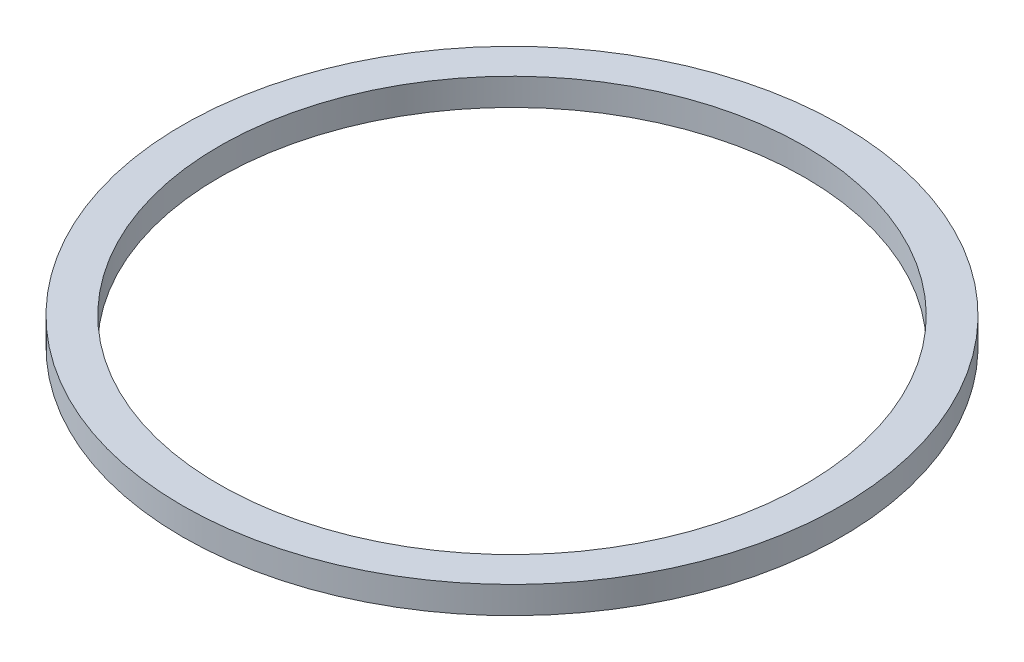
ISO-10303-21;
HEADER;
FILE_DESCRIPTION(('STEP AP214'),'2;1');
FILE_NAME('part.step','',(''),(''),'','','');
FILE_SCHEMA(('AUTOMOTIVE_DESIGN { 1 0 10303 214 1 1 1 1 }'));
ENDSEC;
DATA;
#1=APPLICATION_CONTEXT('core data for automotive mechanical design processes');
#2=APPLICATION_PROTOCOL_DEFINITION('international standard','automotive_design',2000,#1);
#3=PRODUCT_CONTEXT('',#1,'mechanical');
#4=PRODUCT('Part','Part','',(#3));
#5=PRODUCT_RELATED_PRODUCT_CATEGORY('part','',(#4));
#6=PRODUCT_DEFINITION_FORMATION('','',#4);
#7=PRODUCT_DEFINITION_CONTEXT('part definition',#1,'design');
#8=PRODUCT_DEFINITION('design','',#6,#7);
#9=PRODUCT_DEFINITION_SHAPE('','',#8);
#10=(LENGTH_UNIT() NAMED_UNIT(*) SI_UNIT(.MILLI.,.METRE.));
#11=(NAMED_UNIT(*) PLANE_ANGLE_UNIT() SI_UNIT($,.RADIAN.));
#12=(NAMED_UNIT(*) SI_UNIT($,.STERADIAN.) SOLID_ANGLE_UNIT());
#13=UNCERTAINTY_MEASURE_WITH_UNIT(LENGTH_MEASURE(1.E-05),#10,'distance_accuracy_value','');
#14=(GEOMETRIC_REPRESENTATION_CONTEXT(3) GLOBAL_UNCERTAINTY_ASSIGNED_CONTEXT((#13)) GLOBAL_UNIT_ASSIGNED_CONTEXT((#10,
#11,#12)) REPRESENTATION_CONTEXT('',''));
#15=CARTESIAN_POINT('',(0.,0.,0.));
#16=DIRECTION('',(0.,0.,1.));
#17=DIRECTION('',(1.,0.,0.));
#18=AXIS2_PLACEMENT_3D('',#15,#16,#17);
#19=CARTESIAN_POINT('',(-60.,12.9625,0.));
#20=DIRECTION('',(0.,1.,0.));
#21=DIRECTION('',(0.,0.,1.));
#22=AXIS2_PLACEMENT_3D('',#19,#20,#21);
#23=PLANE('',#22);
#24=CARTESIAN_POINT('',(0.,12.9624999999862,0.));
#25=DIRECTION('',(0.,-1.,0.));
#26=DIRECTION('',(0.,0.,-1.));
#27=AXIS2_PLACEMENT_3D('',#24,#25,#26);
#28=CIRCLE('',#27,60.);
#29=CARTESIAN_POINT('',(0.,12.9624999999862,-60.));
#30=VERTEX_POINT('',#29);
#31=EDGE_CURVE('E51',#30,#30,#28,.T.);
#32=ORIENTED_EDGE('',*,*,#31,.F.);
#33=EDGE_LOOP('',(#32));
#34=FACE_BOUND('',#33,.T.);
#35=CARTESIAN_POINT('',(0.,12.9624999999862,0.));
#36=DIRECTION('',(0.,-1.,0.));
#37=DIRECTION('',(0.,0.,-1.));
#38=AXIS2_PLACEMENT_3D('',#35,#36,#37);
#39=CIRCLE('',#38,67.5);
#40=CARTESIAN_POINT('',(0.,12.9624999999862,-67.5));
#41=VERTEX_POINT('',#40);
#42=EDGE_CURVE('E10',#41,#41,#39,.T.);
#43=ORIENTED_EDGE('',*,*,#42,.T.);
#44=EDGE_LOOP('',(#43));
#45=FACE_BOUND('',#44,.T.);
#46=ADVANCED_FACE('F37',(#34,#45),#23,.F.);
#47=CARTESIAN_POINT('',(0.,-200069.047495165,0.));
#48=DIRECTION('',(0.,-1.,0.));
#49=DIRECTION('',(0.,0.,-1.));
#50=AXIS2_PLACEMENT_3D('',#47,#48,#49);
#51=CYLINDRICAL_SURFACE('',#50,67.5);
#52=ORIENTED_EDGE('',*,*,#42,.F.);
#53=EDGE_LOOP('',(#52));
#54=FACE_BOUND('',#53,.T.);
#55=CARTESIAN_POINT('',(0.,18.4999999999889,0.));
#56=DIRECTION('',(0.,-1.,0.));
#57=DIRECTION('',(0.,0.,-1.));
#58=AXIS2_PLACEMENT_3D('',#55,#56,#57);
#59=CIRCLE('',#58,67.5);
#60=CARTESIAN_POINT('',(0.,18.4999999999889,-67.5));
#61=VERTEX_POINT('',#60);
#62=EDGE_CURVE('E43',#61,#61,#59,.T.);
#63=ORIENTED_EDGE('',*,*,#62,.T.);
#64=EDGE_LOOP('',(#63));
#65=FACE_BOUND('',#64,.T.);
#66=ADVANCED_FACE('F60',(#54,#65),#51,.T.);
#67=CARTESIAN_POINT('',(-60.,18.5,0.));
#68=DIRECTION('',(0.,-1.,0.));
#69=DIRECTION('',(0.,0.,-1.));
#70=AXIS2_PLACEMENT_3D('',#67,#68,#69);
#71=PLANE('',#70);
#72=ORIENTED_EDGE('',*,*,#62,.F.);
#73=EDGE_LOOP('',(#72));
#74=FACE_BOUND('',#73,.T.);
#75=CARTESIAN_POINT('',(0.,18.4999999999889,0.));
#76=DIRECTION('',(0.,-1.,0.));
#77=DIRECTION('',(0.,0.,-1.));
#78=AXIS2_PLACEMENT_3D('',#75,#76,#77);
#79=CIRCLE('',#78,60.);
#80=CARTESIAN_POINT('',(0.,18.4999999999889,-60.));
#81=VERTEX_POINT('',#80);
#82=EDGE_CURVE('E47',#81,#81,#79,.T.);
#83=ORIENTED_EDGE('',*,*,#82,.T.);
#84=EDGE_LOOP('',(#83));
#85=FACE_BOUND('',#84,.T.);
#86=ADVANCED_FACE('F64',(#74,#85),#71,.F.);
#87=CARTESIAN_POINT('',(0.,-200069.047495165,0.));
#88=DIRECTION('',(0.,-1.,0.));
#89=DIRECTION('',(0.,0.,-1.));
#90=AXIS2_PLACEMENT_3D('',#87,#88,#89);
#91=CYLINDRICAL_SURFACE('',#90,60.);
#92=ORIENTED_EDGE('',*,*,#82,.F.);
#93=EDGE_LOOP('',(#92));
#94=FACE_BOUND('',#93,.T.);
#95=ORIENTED_EDGE('',*,*,#31,.T.);
#96=EDGE_LOOP('',(#95));
#97=FACE_BOUND('',#96,.T.);
#98=ADVANCED_FACE('F57',(#94,#97),#91,.F.);
#99=CLOSED_SHELL('',(#46,#66,#86,#98));
#100=MANIFOLD_SOLID_BREP('B2',#99);
#101=ADVANCED_BREP_SHAPE_REPRESENTATION('',(#18,#100),#14);
#102=SHAPE_DEFINITION_REPRESENTATION(#9,#101);
ENDSEC;
END-ISO-10303-21;
